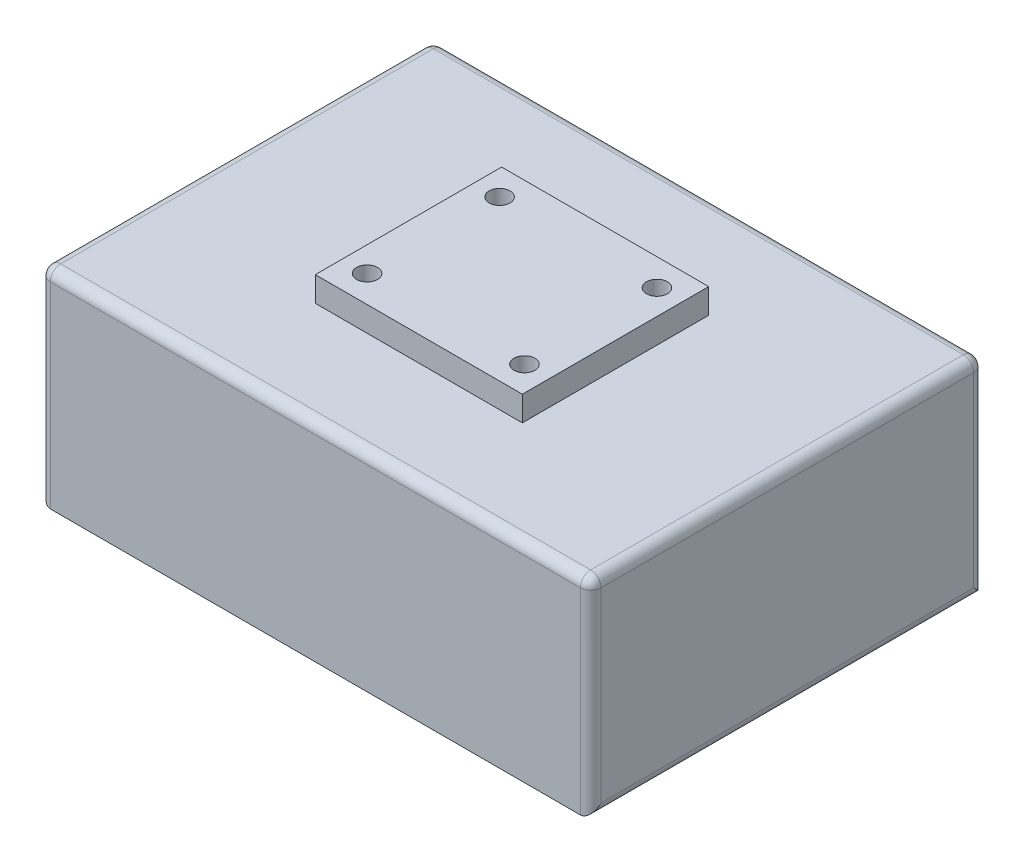
ISO-10303-21;
HEADER;
FILE_DESCRIPTION(('STEP AP214'),'2;1');
FILE_NAME('part.step','',(''),(''),'','','');
FILE_SCHEMA(('AUTOMOTIVE_DESIGN { 1 0 10303 214 1 1 1 1 }'));
ENDSEC;
DATA;
#1=APPLICATION_CONTEXT('core data for automotive mechanical design processes');
#2=APPLICATION_PROTOCOL_DEFINITION('international standard','automotive_design',2000,#1);
#3=PRODUCT_CONTEXT('',#1,'mechanical');
#4=PRODUCT('Part','Part','',(#3));
#5=PRODUCT_RELATED_PRODUCT_CATEGORY('part','',(#4));
#6=PRODUCT_DEFINITION_FORMATION('','',#4);
#7=PRODUCT_DEFINITION_CONTEXT('part definition',#1,'design');
#8=PRODUCT_DEFINITION('design','',#6,#7);
#9=PRODUCT_DEFINITION_SHAPE('','',#8);
#10=(LENGTH_UNIT() NAMED_UNIT(*) SI_UNIT(.MILLI.,.METRE.));
#11=(NAMED_UNIT(*) PLANE_ANGLE_UNIT() SI_UNIT($,.RADIAN.));
#12=(NAMED_UNIT(*) SI_UNIT($,.STERADIAN.) SOLID_ANGLE_UNIT());
#13=UNCERTAINTY_MEASURE_WITH_UNIT(LENGTH_MEASURE(1.E-05),#10,'distance_accuracy_value','');
#14=(GEOMETRIC_REPRESENTATION_CONTEXT(3) GLOBAL_UNCERTAINTY_ASSIGNED_CONTEXT((#13)) GLOBAL_UNIT_ASSIGNED_CONTEXT((#10,
#11,#12)) REPRESENTATION_CONTEXT('',''));
#15=CARTESIAN_POINT('',(0.,0.,0.));
#16=DIRECTION('',(0.,0.,1.));
#17=DIRECTION('',(1.,0.,0.));
#18=AXIS2_PLACEMENT_3D('',#15,#16,#17);
#19=CARTESIAN_POINT('',(0.,50.,0.));
#20=DIRECTION('',(0.,-1.,0.));
#21=DIRECTION('',(0.,0.,-1.));
#22=AXIS2_PLACEMENT_3D('',#19,#20,#21);
#23=PLANE('',#22);
#24=DIRECTION('',(0.,0.,-1.));
#25=VECTOR('',#24,1.);
#26=CARTESIAN_POINT('',(130.5,50.,0.));
#27=LINE('',#26,#25);
#28=CARTESIAN_POINT('',(130.5,50.,-2.5));
#29=VERTEX_POINT('',#28);
#30=CARTESIAN_POINT('',(130.5,50.,-92.5));
#31=VERTEX_POINT('',#30);
#32=EDGE_CURVE('E447',#29,#31,#27,.T.);
#33=ORIENTED_EDGE('',*,*,#32,.T.);
#34=DIRECTION('',(-1.,0.,0.));
#35=VECTOR('',#34,1.);
#36=CARTESIAN_POINT('',(0.,50.,-92.5));
#37=LINE('',#36,#35);
#38=CARTESIAN_POINT('',(2.5,50.,-92.5));
#39=VERTEX_POINT('',#38);
#40=EDGE_CURVE('E451',#31,#39,#37,.T.);
#41=ORIENTED_EDGE('',*,*,#40,.T.);
#42=DIRECTION('',(0.,0.,1.));
#43=VECTOR('',#42,1.);
#44=CARTESIAN_POINT('',(2.5,50.,0.));
#45=LINE('',#44,#43);
#46=CARTESIAN_POINT('',(2.5,50.,-2.5));
#47=VERTEX_POINT('',#46);
#48=EDGE_CURVE('E440',#39,#47,#45,.T.);
#49=ORIENTED_EDGE('',*,*,#48,.T.);
#50=DIRECTION('',(1.,0.,0.));
#51=VECTOR('',#50,1.);
#52=CARTESIAN_POINT('',(0.,50.,-2.5));
#53=LINE('',#52,#51);
#54=EDGE_CURVE('E444',#47,#29,#53,.T.);
#55=ORIENTED_EDGE('',*,*,#54,.T.);
#56=EDGE_LOOP('',(#33,#41,#49,#55));
#57=FACE_BOUND('',#56,.T.);
#58=DIRECTION('',(0.,0.,-1.));
#59=VECTOR('',#58,1.);
#60=CARTESIAN_POINT('',(91.5,50.,-70.));
#61=LINE('',#60,#59);
#62=CARTESIAN_POINT('',(91.5,50.,-25.));
#63=VERTEX_POINT('',#62);
#64=CARTESIAN_POINT('',(91.5,50.,-70.));
#65=VERTEX_POINT('',#64);
#66=EDGE_CURVE('E203',#63,#65,#61,.T.);
#67=ORIENTED_EDGE('',*,*,#66,.F.);
#68=DIRECTION('',(1.,0.,0.));
#69=VECTOR('',#68,1.);
#70=CARTESIAN_POINT('',(41.5,50.,-25.));
#71=LINE('',#70,#69);
#72=CARTESIAN_POINT('',(41.5,50.,-25.));
#73=VERTEX_POINT('',#72);
#74=EDGE_CURVE('E200',#73,#63,#71,.T.);
#75=ORIENTED_EDGE('',*,*,#74,.F.);
#76=DIRECTION('',(0.,0.,1.));
#77=VECTOR('',#76,1.);
#78=CARTESIAN_POINT('',(41.5,50.,-70.));
#79=LINE('',#78,#77);
#80=CARTESIAN_POINT('',(41.5,50.,-70.));
#81=VERTEX_POINT('',#80);
#82=EDGE_CURVE('E67',#81,#73,#79,.T.);
#83=ORIENTED_EDGE('',*,*,#82,.F.);
#84=DIRECTION('',(-1.,0.,0.));
#85=VECTOR('',#84,1.);
#86=CARTESIAN_POINT('',(41.5,50.,-70.));
#87=LINE('',#86,#85);
#88=EDGE_CURVE('E62',#65,#81,#87,.T.);
#89=ORIENTED_EDGE('',*,*,#88,.F.);
#90=EDGE_LOOP('',(#67,#75,#83,#89));
#91=FACE_BOUND('',#90,.T.);
#92=ADVANCED_FACE('F39',(#57,#91),#23,.F.);
#93=CARTESIAN_POINT('',(0.,0.,0.));
#94=DIRECTION('',(0.,-1.,0.));
#95=DIRECTION('',(0.,0.,-1.));
#96=AXIS2_PLACEMENT_3D('',#93,#94,#95);
#97=PLANE('',#96);
#98=DIRECTION('',(-1.,0.,0.));
#99=VECTOR('',#98,1.);
#100=CARTESIAN_POINT('',(0.,0.,-95.));
#101=LINE('',#100,#99);
#102=CARTESIAN_POINT('',(130.5,0.,-95.));
#103=VERTEX_POINT('',#102);
#104=CARTESIAN_POINT('',(2.5,0.,-95.));
#105=VERTEX_POINT('',#104);
#106=EDGE_CURVE('E227',#103,#105,#101,.T.);
#107=ORIENTED_EDGE('',*,*,#106,.F.);
#108=DIRECTION('',(0.,0.,-1.));
#109=VECTOR('',#108,1.);
#110=CARTESIAN_POINT('',(130.5,0.,0.));
#111=LINE('',#110,#109);
#112=CARTESIAN_POINT('',(130.5,0.,-94.));
#113=VERTEX_POINT('',#112);
#114=EDGE_CURVE('E260',#103,#113,#111,.F.);
#115=ORIENTED_EDGE('',*,*,#114,.T.);
#116=DIRECTION('',(-1.,0.,0.));
#117=VECTOR('',#116,1.);
#118=CARTESIAN_POINT('',(236.97716095374,0.,-94.));
#119=LINE('',#118,#117);
#120=CARTESIAN_POINT('',(2.5,0.,-94.));
#121=VERTEX_POINT('',#120);
#122=EDGE_CURVE('E220',#113,#121,#119,.T.);
#123=ORIENTED_EDGE('',*,*,#122,.T.);
#124=DIRECTION('',(0.,0.,1.));
#125=VECTOR('',#124,1.);
#126=CARTESIAN_POINT('',(2.5,0.,-95.));
#127=LINE('',#126,#125);
#128=EDGE_CURVE('E254',#121,#105,#127,.F.);
#129=ORIENTED_EDGE('',*,*,#128,.T.);
#130=EDGE_LOOP('',(#107,#115,#123,#129));
#131=FACE_BOUND('',#130,.T.);
#132=ADVANCED_FACE('F466',(#131),#97,.T.);
#133=CARTESIAN_POINT('',(0.,50.,0.));
#134=DIRECTION('',(1.,0.,0.));
#135=DIRECTION('',(0.,0.,-1.));
#136=AXIS2_PLACEMENT_3D('',#133,#134,#135);
#137=PLANE('',#136);
#138=DIRECTION('',(0.,0.,1.));
#139=VECTOR('',#138,1.);
#140=CARTESIAN_POINT('',(0.,47.5,0.));
#141=LINE('',#140,#139);
#142=CARTESIAN_POINT('',(0.,47.5,-2.5));
#143=VERTEX_POINT('',#142);
#144=CARTESIAN_POINT('',(0.,47.5,-92.5));
#145=VERTEX_POINT('',#144);
#146=EDGE_CURVE('E390',#143,#145,#141,.F.);
#147=ORIENTED_EDGE('',*,*,#146,.T.);
#148=DIRECTION('',(0.,-1.,0.));
#149=VECTOR('',#148,1.);
#150=CARTESIAN_POINT('',(0.,50.,-92.5));
#151=LINE('',#150,#149);
#152=CARTESIAN_POINT('',(0.,2.5,-92.5));
#153=VERTEX_POINT('',#152);
#154=EDGE_CURVE('E388',#145,#153,#151,.T.);
#155=ORIENTED_EDGE('',*,*,#154,.T.);
#156=DIRECTION('',(0.,0.,1.));
#157=VECTOR('',#156,1.);
#158=CARTESIAN_POINT('',(0.,2.5,-90.));
#159=LINE('',#158,#157);
#160=CARTESIAN_POINT('',(0.,2.5,-92.3799134149852));
#161=VERTEX_POINT('',#160);
#162=EDGE_CURVE('E383',#153,#161,#159,.T.);
#163=ORIENTED_EDGE('',*,*,#162,.T.);
#164=CARTESIAN_POINT('',(0.,0.,-47.5));
#165=DIRECTION('',(1.,0.,0.));
#166=DIRECTION('',(0.,0.,-1.));
#167=AXIS2_PLACEMENT_3D('',#164,#165,#166);
#168=CIRCLE('',#167,44.9494897427832);
#169=CARTESIAN_POINT('',(0.,2.5,-2.62008658501478));
#170=VERTEX_POINT('',#169);
#171=EDGE_CURVE('E379',#161,#170,#168,.T.);
#172=ORIENTED_EDGE('',*,*,#171,.T.);
#173=DIRECTION('',(0.,0.,1.));
#174=VECTOR('',#173,1.);
#175=CARTESIAN_POINT('',(0.,2.5,0.));
#176=LINE('',#175,#174);
#177=CARTESIAN_POINT('',(0.,2.5,-2.5));
#178=VERTEX_POINT('',#177);
#179=EDGE_CURVE('E455',#170,#178,#176,.T.);
#180=ORIENTED_EDGE('',*,*,#179,.T.);
#181=DIRECTION('',(0.,-1.,0.));
#182=VECTOR('',#181,1.);
#183=CARTESIAN_POINT('',(0.,50.,-2.5));
#184=LINE('',#183,#182);
#185=EDGE_CURVE('E457',#178,#143,#184,.F.);
#186=ORIENTED_EDGE('',*,*,#185,.T.);
#187=EDGE_LOOP('',(#147,#155,#163,#172,#180,#186));
#188=FACE_BOUND('',#187,.T.);
#189=ADVANCED_FACE('F459',(#188),#137,.F.);
#190=CARTESIAN_POINT('',(0.,50.,0.));
#191=DIRECTION('',(0.,0.,-1.));
#192=DIRECTION('',(-1.,0.,0.));
#193=AXIS2_PLACEMENT_3D('',#190,#191,#192);
#194=PLANE('',#193);
#195=DIRECTION('',(1.,0.,0.));
#196=VECTOR('',#195,1.);
#197=CARTESIAN_POINT('',(0.,0.,0.));
#198=LINE('',#197,#196);
#199=CARTESIAN_POINT('',(2.5,0.,0.));
#200=VERTEX_POINT('',#199);
#201=CARTESIAN_POINT('',(130.5,0.,0.));
#202=VERTEX_POINT('',#201);
#203=EDGE_CURVE('E215',#200,#202,#198,.T.);
#204=ORIENTED_EDGE('',*,*,#203,.T.);
#205=DIRECTION('',(0.,-1.,0.));
#206=VECTOR('',#205,1.);
#207=CARTESIAN_POINT('',(130.5,50.,0.));
#208=LINE('',#207,#206);
#209=CARTESIAN_POINT('',(130.5,47.5,0.));
#210=VERTEX_POINT('',#209);
#211=EDGE_CURVE('E245',#202,#210,#208,.F.);
#212=ORIENTED_EDGE('',*,*,#211,.T.);
#213=DIRECTION('',(1.,0.,0.));
#214=VECTOR('',#213,1.);
#215=CARTESIAN_POINT('',(0.,47.5,0.));
#216=LINE('',#215,#214);
#217=CARTESIAN_POINT('',(2.5,47.5,0.));
#218=VERTEX_POINT('',#217);
#219=EDGE_CURVE('E243',#210,#218,#216,.F.);
#220=ORIENTED_EDGE('',*,*,#219,.T.);
#221=DIRECTION('',(0.,-1.,0.));
#222=VECTOR('',#221,1.);
#223=CARTESIAN_POINT('',(2.5,50.,0.));
#224=LINE('',#223,#222);
#225=EDGE_CURVE('E241',#218,#200,#224,.T.);
#226=ORIENTED_EDGE('',*,*,#225,.T.);
#227=EDGE_LOOP('',(#204,#212,#220,#226));
#228=FACE_BOUND('',#227,.T.);
#229=ADVANCED_FACE('F581',(#228),#194,.F.);
#230=CARTESIAN_POINT('',(133.,50.,0.));
#231=DIRECTION('',(-1.,0.,0.));
#232=DIRECTION('',(0.,0.,1.));
#233=AXIS2_PLACEMENT_3D('',#230,#231,#232);
#234=PLANE('',#233);
#235=DIRECTION('',(0.,-1.,0.));
#236=VECTOR('',#235,1.);
#237=CARTESIAN_POINT('',(133.,50.,-2.5));
#238=LINE('',#237,#236);
#239=CARTESIAN_POINT('',(133.,47.5,-2.5));
#240=VERTEX_POINT('',#239);
#241=CARTESIAN_POINT('',(133.,2.5,-2.5));
#242=VERTEX_POINT('',#241);
#243=EDGE_CURVE('E236',#240,#242,#238,.T.);
#244=ORIENTED_EDGE('',*,*,#243,.T.);
#245=DIRECTION('',(0.,0.,-1.));
#246=VECTOR('',#245,1.);
#247=CARTESIAN_POINT('',(133.,2.5,-95.));
#248=LINE('',#247,#246);
#249=CARTESIAN_POINT('',(133.,2.5,-92.5));
#250=VERTEX_POINT('',#249);
#251=EDGE_CURVE('E239',#242,#250,#248,.T.);
#252=ORIENTED_EDGE('',*,*,#251,.T.);
#253=DIRECTION('',(0.,-1.,0.));
#254=VECTOR('',#253,1.);
#255=CARTESIAN_POINT('',(133.,50.,-92.5));
#256=LINE('',#255,#254);
#257=CARTESIAN_POINT('',(133.,47.5,-92.5));
#258=VERTEX_POINT('',#257);
#259=EDGE_CURVE('E234',#250,#258,#256,.F.);
#260=ORIENTED_EDGE('',*,*,#259,.T.);
#261=DIRECTION('',(0.,0.,-1.));
#262=VECTOR('',#261,1.);
#263=CARTESIAN_POINT('',(133.,47.5,0.));
#264=LINE('',#263,#262);
#265=EDGE_CURVE('E232',#258,#240,#264,.F.);
#266=ORIENTED_EDGE('',*,*,#265,.T.);
#267=EDGE_LOOP('',(#244,#252,#260,#266));
#268=FACE_BOUND('',#267,.T.);
#269=ADVANCED_FACE('F574',(#268),#234,.F.);
#270=CARTESIAN_POINT('',(0.,50.,-95.));
#271=DIRECTION('',(0.,0.,1.));
#272=DIRECTION('',(1.,0.,0.));
#273=AXIS2_PLACEMENT_3D('',#270,#271,#272);
#274=PLANE('',#273);
#275=DIRECTION('',(-1.,0.,0.));
#276=VECTOR('',#275,1.);
#277=CARTESIAN_POINT('',(0.,47.5,-95.));
#278=LINE('',#277,#276);
#279=CARTESIAN_POINT('',(2.5,47.5,-95.));
#280=VERTEX_POINT('',#279);
#281=CARTESIAN_POINT('',(130.5,47.5,-95.));
#282=VERTEX_POINT('',#281);
#283=EDGE_CURVE('E250',#280,#282,#278,.F.);
#284=ORIENTED_EDGE('',*,*,#283,.T.);
#285=DIRECTION('',(0.,-1.,0.));
#286=VECTOR('',#285,1.);
#287=CARTESIAN_POINT('',(130.5,50.,-95.));
#288=LINE('',#287,#286);
#289=EDGE_CURVE('E252',#282,#103,#288,.T.);
#290=ORIENTED_EDGE('',*,*,#289,.T.);
#291=ORIENTED_EDGE('',*,*,#106,.T.);
#292=DIRECTION('',(0.,-1.,0.));
#293=VECTOR('',#292,1.);
#294=CARTESIAN_POINT('',(2.5,50.,-95.));
#295=LINE('',#294,#293);
#296=EDGE_CURVE('E248',#105,#280,#295,.F.);
#297=ORIENTED_EDGE('',*,*,#296,.T.);
#298=EDGE_LOOP('',(#284,#290,#291,#297));
#299=FACE_BOUND('',#298,.T.);
#300=ADVANCED_FACE('F566',(#299),#274,.F.);
#301=DIRECTION('',(-1.,0.,0.));
#302=VECTOR('',#301,1.);
#303=CARTESIAN_POINT('',(236.97716095374,0.,-1.));
#304=LINE('',#303,#302);
#305=CARTESIAN_POINT('',(130.5,0.,-1.));
#306=VERTEX_POINT('',#305);
#307=CARTESIAN_POINT('',(2.5,0.,-1.));
#308=VERTEX_POINT('',#307);
#309=EDGE_CURVE('E216',#306,#308,#304,.T.);
#310=ORIENTED_EDGE('',*,*,#309,.F.);
#311=DIRECTION('',(0.,0.,-1.));
#312=VECTOR('',#311,1.);
#313=CARTESIAN_POINT('',(130.5,0.,0.));
#314=LINE('',#313,#312);
#315=EDGE_CURVE('E258',#306,#202,#314,.F.);
#316=ORIENTED_EDGE('',*,*,#315,.T.);
#317=ORIENTED_EDGE('',*,*,#203,.F.);
#318=DIRECTION('',(0.,0.,1.));
#319=VECTOR('',#318,1.);
#320=CARTESIAN_POINT('',(2.5,0.,-4.99999999999999));
#321=LINE('',#320,#319);
#322=EDGE_CURVE('E256',#200,#308,#321,.F.);
#323=ORIENTED_EDGE('',*,*,#322,.T.);
#324=EDGE_LOOP('',(#310,#316,#317,#323));
#325=FACE_BOUND('',#324,.T.);
#326=ADVANCED_FACE('F282',(#325),#97,.T.);
#327=CARTESIAN_POINT('',(236.97716095374,0.,-47.5));
#328=DIRECTION('',(-1.,0.,0.));
#329=DIRECTION('',(0.,0.,1.));
#330=AXIS2_PLACEMENT_3D('',#327,#328,#329);
#331=CYLINDRICAL_SURFACE('',#330,46.5);
#332=ORIENTED_EDGE('',*,*,#122,.F.);
#333=CARTESIAN_POINT('',(130.5,0.,-94.));
#334=CARTESIAN_POINT('',(130.584181603792,2.13688325373513E-05,-94.000003423339));
#335=CARTESIAN_POINT('',(130.667939072362,0.00424124135175873,-94.0000028489092));
#336=CARTESIAN_POINT('',(130.834605739028,0.0210779937604642,-93.9999937045119));
#337=CARTESIAN_POINT('',(130.917514937125,0.033694873646851,-93.9999851345445));
#338=CARTESIAN_POINT('',(131.,0.0505102572168243,-93.9999725668082));
#339=B_SPLINE_CURVE_WITH_KNOTS('',3,(#333,#334,#335,#336,#337,#338),.UNSPECIFIED.,.F.,.F.,(4,2,
4),(0.,0.251591112305826,0.503182224518847),.UNSPECIFIED.);
#340=CARTESIAN_POINT('',(131.,0.0505102572168239,-93.9999725668082));
#341=VERTEX_POINT('',#340);
#342=EDGE_CURVE('E296',#113,#341,#339,.T.);
#343=ORIENTED_EDGE('',*,*,#342,.T.);
#344=CARTESIAN_POINT('',(131.,0.,-47.5));
#345=DIRECTION('',(-1.,0.,0.));
#346=DIRECTION('',(0.,0.,1.));
#347=AXIS2_PLACEMENT_3D('',#344,#345,#346);
#348=CIRCLE('',#347,46.5);
#349=CARTESIAN_POINT('',(131.,0.0505102572168239,-1.0000274331918));
#350=VERTEX_POINT('',#349);
#351=EDGE_CURVE('E212',#341,#350,#348,.F.);
#352=ORIENTED_EDGE('',*,*,#351,.T.);
#353=CARTESIAN_POINT('',(131.,0.0505102572168239,-1.0000274331918));
#354=CARTESIAN_POINT('',(130.917514937125,0.0336948736468505,-1.00001486545554));
#355=CARTESIAN_POINT('',(130.834605739028,0.0210779937604639,-1.0000062954881));
#356=CARTESIAN_POINT('',(130.667939072362,0.00424124135175931,-0.999997151090829));
#357=CARTESIAN_POINT('',(130.584181603792,2.13688325386669E-05,-0.999996576661008));
#358=CARTESIAN_POINT('',(130.5,0.,-1.));
#359=B_SPLINE_CURVE_WITH_KNOTS('',3,(#353,#354,#355,#356,#357,#358),.UNSPECIFIED.,.F.,.F.,(4,2,
4),(0.,0.251591112213021,0.503182224518847),.UNSPECIFIED.);
#360=EDGE_CURVE('E290',#350,#306,#359,.T.);
#361=ORIENTED_EDGE('',*,*,#360,.T.);
#362=ORIENTED_EDGE('',*,*,#309,.T.);
#363=CARTESIAN_POINT('',(2.5,0.,-1.));
#364=CARTESIAN_POINT('',(2.41581839620813,2.13688325377501E-05,-0.999996576661009));
#365=CARTESIAN_POINT('',(2.33206092763793,0.00424124135175869,-0.999997151090831));
#366=CARTESIAN_POINT('',(2.16539426097158,0.0210779937604629,-1.0000062954881));
#367=CARTESIAN_POINT('',(2.08248506287511,0.0336948736468501,-1.00001486545554));
#368=CARTESIAN_POINT('',(2.,0.0505102572168243,-1.0000274331918));
#369=B_SPLINE_CURVE_WITH_KNOTS('',3,(#363,#364,#365,#366,#367,#368),.UNSPECIFIED.,.F.,.F.,(4,2,
4),(0.,0.251591112305807,0.503182224518847),.UNSPECIFIED.);
#370=CARTESIAN_POINT('',(2.,0.0505102572168239,-1.0000274331918));
#371=VERTEX_POINT('',#370);
#372=EDGE_CURVE('E269',#308,#371,#369,.T.);
#373=ORIENTED_EDGE('',*,*,#372,.T.);
#374=CARTESIAN_POINT('',(2.,0.,-47.5));
#375=DIRECTION('',(-1.,0.,0.));
#376=DIRECTION('',(0.,0.,1.));
#377=AXIS2_PLACEMENT_3D('',#374,#375,#376);
#378=CIRCLE('',#377,46.5);
#379=CARTESIAN_POINT('',(2.,0.0505102572168239,-93.9999725668082));
#380=VERTEX_POINT('',#379);
#381=EDGE_CURVE('E217',#371,#380,#378,.T.);
#382=ORIENTED_EDGE('',*,*,#381,.T.);
#383=CARTESIAN_POINT('',(2.,0.0505102572168239,-93.9999725668082));
#384=CARTESIAN_POINT('',(2.08248506287511,0.0336948736468496,-93.9999851345445));
#385=CARTESIAN_POINT('',(2.16539426097158,0.0210779937604626,-93.9999937045119));
#386=CARTESIAN_POINT('',(2.33206092763793,0.0042412413517591,-94.0000028489092));
#387=CARTESIAN_POINT('',(2.41581839620813,2.13688325388543E-05,-94.000003423339));
#388=CARTESIAN_POINT('',(2.5,0.,-94.));
#389=B_SPLINE_CURVE_WITH_KNOTS('',3,(#383,#384,#385,#386,#387,#388),.UNSPECIFIED.,.F.,.F.,(4,2,
4),(0.,0.251591112213039,0.503182224518847),.UNSPECIFIED.);
#390=EDGE_CURVE('E262',#380,#121,#389,.T.);
#391=ORIENTED_EDGE('',*,*,#390,.T.);
#392=EDGE_LOOP('',(#332,#343,#352,#361,#362,#373,#382,#391));
#393=FACE_BOUND('',#392,.T.);
#394=ADVANCED_FACE('F276',(#393),#331,.F.);
#395=CARTESIAN_POINT('',(2.,0.,-47.5));
#396=DIRECTION('',(-1.,0.,0.));
#397=DIRECTION('',(0.,0.,1.));
#398=AXIS2_PLACEMENT_3D('',#395,#396,#397);
#399=PLANE('',#398);
#400=ORIENTED_EDGE('',*,*,#381,.F.);
#401=DIRECTION('',(0.,0.,-1.));
#402=VECTOR('',#401,1.);
#403=CARTESIAN_POINT('',(2.,0.0505102572168239,-1.0000274331918));
#404=LINE('',#403,#402);
#405=CARTESIAN_POINT('',(2.,0.050510257216824,-5.00003001514099));
#406=VERTEX_POINT('',#405);
#407=EDGE_CURVE('E12',#371,#406,#404,.T.);
#408=ORIENTED_EDGE('',*,*,#407,.T.);
#409=CARTESIAN_POINT('',(2.,0.,-47.5));
#410=DIRECTION('',(-1.,0.,0.));
#411=DIRECTION('',(0.,0.,1.));
#412=AXIS2_PLACEMENT_3D('',#409,#410,#411);
#413=CIRCLE('',#412,42.5);
#414=CARTESIAN_POINT('',(2.,0.0505102572168242,-89.999969984859));
#415=VERTEX_POINT('',#414);
#416=EDGE_CURVE('E230',#406,#415,#413,.T.);
#417=ORIENTED_EDGE('',*,*,#416,.T.);
#418=DIRECTION('',(0.,0.,-1.));
#419=VECTOR('',#418,1.);
#420=CARTESIAN_POINT('',(2.,0.0505102572168242,-89.999969984859));
#421=LINE('',#420,#419);
#422=EDGE_CURVE('E54',#415,#380,#421,.T.);
#423=ORIENTED_EDGE('',*,*,#422,.T.);
#424=EDGE_LOOP('',(#400,#408,#417,#423));
#425=FACE_BOUND('',#424,.T.);
#426=ADVANCED_FACE('F281',(#425),#399,.F.);
#427=CARTESIAN_POINT('',(131.,50.,0.));
#428=DIRECTION('',(-1.,0.,0.));
#429=DIRECTION('',(0.,0.,1.));
#430=AXIS2_PLACEMENT_3D('',#427,#428,#429);
#431=PLANE('',#430);
#432=ORIENTED_EDGE('',*,*,#351,.F.);
#433=DIRECTION('',(0.,0.,1.));
#434=VECTOR('',#433,1.);
#435=CARTESIAN_POINT('',(131.,0.0505102572168239,-93.9999725668082));
#436=LINE('',#435,#434);
#437=EDGE_CURVE('E445',#341,#350,#436,.T.);
#438=ORIENTED_EDGE('',*,*,#437,.T.);
#439=EDGE_LOOP('',(#432,#438));
#440=FACE_BOUND('',#439,.T.);
#441=ADVANCED_FACE('F542',(#440),#431,.T.);
#442=CARTESIAN_POINT('',(2.5,2.5,0.));
#443=DIRECTION('',(0.,0.,-1.));
#444=DIRECTION('',(-1.,0.,0.));
#445=AXIS2_PLACEMENT_3D('',#442,#443,#444);
#446=CYLINDRICAL_SURFACE('',#445,2.5);
#447=ORIENTED_EDGE('',*,*,#390,.F.);
#448=ORIENTED_EDGE('',*,*,#422,.F.);
#449=CARTESIAN_POINT('',(2.,0.0505102572168242,-89.999969984859));
#450=CARTESIAN_POINT('',(1.93739125426876,0.063277521848252,-90.0127217609618));
#451=CARTESIAN_POINT('',(1.87577360760766,0.0783671962346952,-90.0277881196874));
#452=CARTESIAN_POINT('',(1.75503098622294,0.112755179350425,-90.0620990994424));
#453=CARTESIAN_POINT('',(1.6959021395973,0.132046638877352,-90.0813369204733));
#454=CARTESIAN_POINT('',(1.58102686568073,0.174231317447271,-90.1233700487397));
#455=CARTESIAN_POINT('',(1.52525225205664,0.197086089230291,-90.1461273625013));
#456=CARTESIAN_POINT('',(1.41667095469396,0.246125577396846,-90.1949129058237));
#457=CARTESIAN_POINT('',(1.3638654692533,0.272311624522098,-90.220942442487));
#458=CARTESIAN_POINT('',(1.21084851586098,0.354900659830152,-90.3029536118089));
#459=CARTESIAN_POINT('',(1.11519699473914,0.415652810146655,-90.3631754012105));
#460=CARTESIAN_POINT('',(0.936409953736706,0.54615716058448,-90.4922268039608));
#461=CARTESIAN_POINT('',(0.853314254698965,0.61593674414051,-90.561082586914));
#462=CARTESIAN_POINT('',(0.654770967198994,0.804908380203639,-90.7470572449916));
#463=CARTESIAN_POINT('',(0.548629304895066,0.929228291300059,-90.8689479684465));
#464=CARTESIAN_POINT('',(0.365408069993122,1.18894768960779,-91.1224233075319));
#465=CARTESIAN_POINT('',(0.288393083925409,1.32437099875773,-91.2540287020115));
#466=CARTESIAN_POINT('',(0.149864375016152,1.62835528716115,-91.5480455093412));
#467=CARTESIAN_POINT('',(0.0939810589274392,1.79836208423312,-91.7115994478339));
#468=CARTESIAN_POINT('',(0.019355255745988,2.14309247914608,-92.0413591404464));
#469=CARTESIAN_POINT('',(0.000518845557465326,2.31780300768397,-92.2075571088789));
#470=CARTESIAN_POINT('',(3.53018153403255E-06,2.49515301888906,-92.3753287428903));
#471=CARTESIAN_POINT('',(6.33693359578801E-09,2.497576491833,-92.3776211509131));
#472=CARTESIAN_POINT('',(0.,2.5,-92.3799134149852));
#473=B_SPLINE_CURVE_WITH_KNOTS('',3,(#449,#450,#451,#452,#453,#454,#455,#456,#457,#458,#459,
#460,#461,#462,#463,#464,#465,#466,#467,#468,#469,#470,#471,#472),.UNSPECIFIED.,.F.,.F.,(4,2,2,
2,2,2,2,2,2,2,2,4),(0.,0.19531789050569,0.390319750775296,0.583347130814134,0.776451862898057,
1.15983852424362,1.54441666797508,2.1527488863318,2.7624222415427,3.48663396900635,
4.2090072611757,4.21901501515334),.UNSPECIFIED.);
#474=EDGE_CURVE('E44',#161,#415,#473,.F.);
#475=ORIENTED_EDGE('',*,*,#474,.F.);
#476=ORIENTED_EDGE('',*,*,#162,.F.);
#477=CARTESIAN_POINT('',(2.5,2.5,-92.5));
#478=DIRECTION('',(0.,0.707106781186547,-0.707106781186547));
#479=DIRECTION('',(0.,-0.707106781186547,-0.707106781186547));
#480=AXIS2_PLACEMENT_3D('',#477,#478,#479);
#481=ELLIPSE('',#480,3.53553390593274,2.5);
#482=EDGE_CURVE('E366',#105,#153,#481,.T.);
#483=ORIENTED_EDGE('',*,*,#482,.F.);
#484=ORIENTED_EDGE('',*,*,#128,.F.);
#485=EDGE_LOOP('',(#447,#448,#475,#476,#483,#484));
#486=FACE_BOUND('',#485,.T.);
#487=ADVANCED_FACE('F41',(#486),#446,.T.);
#488=CARTESIAN_POINT('',(2.5,0.,-47.5));
#489=DIRECTION('',(1.,0.,0.));
#490=DIRECTION('',(0.,0.,-1.));
#491=AXIS2_PLACEMENT_3D('',#488,#489,#490);
#492=TOROIDAL_SURFACE('',#491,44.9494897427832,2.5);
#493=ORIENTED_EDGE('',*,*,#474,.T.);
#494=ORIENTED_EDGE('',*,*,#416,.F.);
#495=CARTESIAN_POINT('',(2.,0.050510257216824,-5.00003001514099));
#496=CARTESIAN_POINT('',(1.93739125426877,0.0632775218482504,-4.98727823903817));
#497=CARTESIAN_POINT('',(1.87577360760767,0.0783671962346938,-4.97221188031255));
#498=CARTESIAN_POINT('',(1.75503098622294,0.112755179350424,-4.9379009005576));
#499=CARTESIAN_POINT('',(1.6959021395973,0.132046638877352,-4.91866307952672));
#500=CARTESIAN_POINT('',(1.58102686568073,0.174231317447272,-4.87662995126034));
#501=CARTESIAN_POINT('',(1.52525225205664,0.197086089230292,-4.85387263749865));
#502=CARTESIAN_POINT('',(1.41667095469396,0.246125577396846,-4.80508709417631));
#503=CARTESIAN_POINT('',(1.3638654692533,0.272311624522098,-4.77905755751297));
#504=CARTESIAN_POINT('',(1.21084851586098,0.35490065983015,-4.69704638819108));
#505=CARTESIAN_POINT('',(1.11519699473915,0.415652810146649,-4.63682459878947));
#506=CARTESIAN_POINT('',(0.936409953736717,0.546157160584471,-4.50777319603915));
#507=CARTESIAN_POINT('',(0.853314254698973,0.615936744140503,-4.43891741308602));
#508=CARTESIAN_POINT('',(0.654770967198998,0.804908380203634,-4.25294275500844));
#509=CARTESIAN_POINT('',(0.54862930489507,0.929228291300052,-4.13105203155349));
#510=CARTESIAN_POINT('',(0.365408069993127,1.18894768960778,-3.87757669246806));
#511=CARTESIAN_POINT('',(0.288393083925414,1.32437099875772,-3.74597129798855));
#512=CARTESIAN_POINT('',(0.149864375016155,1.62835528716114,-3.4519544906588));
#513=CARTESIAN_POINT('',(0.0939810589274414,1.79836208423311,-3.28840055216608));
#514=CARTESIAN_POINT('',(0.0193552557459911,2.14309247914606,-2.95864085955363));
#515=CARTESIAN_POINT('',(0.000518845557469947,2.31780300768394,-2.7924428911211));
#516=CARTESIAN_POINT('',(3.53018153415955E-06,2.49515301888906,-2.62467125710971));
#517=CARTESIAN_POINT('',(6.33693366021947E-09,2.497576491833,-2.62237884908694));
#518=CARTESIAN_POINT('',(0.,2.5,-2.62008658501478));
#519=B_SPLINE_CURVE_WITH_KNOTS('',3,(#495,#496,#497,#498,#499,#500,#501,#502,#503,#504,#505,
#506,#507,#508,#509,#510,#511,#512,#513,#514,#515,#516,#517,#518),.UNSPECIFIED.,.F.,.F.,(4,2,2,
2,2,2,2,2,2,2,2,4),(0.,0.195317890505689,0.390319750775294,0.583347130814143,0.776451862898055,
1.15983852424361,1.54441666797508,2.15274888633179,2.76242224154269,3.48663396900634,
4.20900726117569,4.21901501515333),.UNSPECIFIED.);
#520=EDGE_CURVE('E359',#170,#406,#519,.F.);
#521=ORIENTED_EDGE('',*,*,#520,.F.);
#522=ORIENTED_EDGE('',*,*,#171,.F.);
#523=EDGE_LOOP('',(#493,#494,#521,#522));
#524=FACE_BOUND('',#523,.T.);
#525=ADVANCED_FACE('F351',(#524),#492,.T.);
#526=CARTESIAN_POINT('',(2.5,50.,-92.5));
#527=DIRECTION('',(0.,-1.,0.));
#528=DIRECTION('',(0.,0.,-1.));
#529=AXIS2_PLACEMENT_3D('',#526,#527,#528);
#530=CYLINDRICAL_SURFACE('',#529,2.5);
#531=ORIENTED_EDGE('',*,*,#482,.T.);
#532=ORIENTED_EDGE('',*,*,#154,.F.);
#533=CARTESIAN_POINT('',(2.5,47.5,-92.5));
#534=DIRECTION('',(0.,1.,0.));
#535=DIRECTION('',(0.,0.,1.));
#536=AXIS2_PLACEMENT_3D('',#533,#534,#535);
#537=CIRCLE('',#536,2.5);
#538=EDGE_CURVE('E367',#280,#145,#537,.T.);
#539=ORIENTED_EDGE('',*,*,#538,.F.);
#540=ORIENTED_EDGE('',*,*,#296,.F.);
#541=EDGE_LOOP('',(#531,#532,#539,#540));
#542=FACE_BOUND('',#541,.T.);
#543=ADVANCED_FACE('F354',(#542),#530,.T.);
#544=CARTESIAN_POINT('',(2.5,2.5,0.));
#545=DIRECTION('',(0.,0.,-1.));
#546=DIRECTION('',(-1.,0.,0.));
#547=AXIS2_PLACEMENT_3D('',#544,#545,#546);
#548=CYLINDRICAL_SURFACE('',#547,2.5);
#549=ORIENTED_EDGE('',*,*,#372,.F.);
#550=ORIENTED_EDGE('',*,*,#322,.F.);
#551=CARTESIAN_POINT('',(2.5,2.5,-2.5));
#552=DIRECTION('',(0.,-0.707106781186547,-0.707106781186547));
#553=DIRECTION('',(0.,0.707106781186547,-0.707106781186547));
#554=AXIS2_PLACEMENT_3D('',#551,#552,#553);
#555=ELLIPSE('',#554,3.53553390593274,2.5);
#556=EDGE_CURVE('E427',#178,#200,#555,.F.);
#557=ORIENTED_EDGE('',*,*,#556,.F.);
#558=ORIENTED_EDGE('',*,*,#179,.F.);
#559=ORIENTED_EDGE('',*,*,#520,.T.);
#560=ORIENTED_EDGE('',*,*,#407,.F.);
#561=EDGE_LOOP('',(#549,#550,#557,#558,#559,#560));
#562=FACE_BOUND('',#561,.T.);
#563=ADVANCED_FACE('F349',(#562),#548,.T.);
#564=CARTESIAN_POINT('',(2.5,47.5,-92.5));
#565=DIRECTION('',(-1.,0.,0.));
#566=DIRECTION('',(0.,0.,1.));
#567=AXIS2_PLACEMENT_3D('',#564,#565,#566);
#568=SPHERICAL_SURFACE('',#567,2.5);
#569=CARTESIAN_POINT('',(2.5,47.5,-92.5));
#570=DIRECTION('',(-1.,0.,0.));
#571=DIRECTION('',(0.,0.,1.));
#572=AXIS2_PLACEMENT_3D('',#569,#570,#571);
#573=CIRCLE('',#572,2.5);
#574=EDGE_CURVE('E422',#280,#39,#573,.F.);
#575=ORIENTED_EDGE('',*,*,#574,.F.);
#576=ORIENTED_EDGE('',*,*,#538,.T.);
#577=CARTESIAN_POINT('',(2.5,47.5,-92.5));
#578=DIRECTION('',(0.,0.,-1.));
#579=DIRECTION('',(-1.,0.,0.));
#580=AXIS2_PLACEMENT_3D('',#577,#578,#579);
#581=CIRCLE('',#580,2.5);
#582=EDGE_CURVE('E425',#39,#145,#581,.F.);
#583=ORIENTED_EDGE('',*,*,#582,.F.);
#584=EDGE_LOOP('',(#575,#576,#583));
#585=FACE_BOUND('',#584,.T.);
#586=ADVANCED_FACE('F346',(#585),#568,.T.);
#587=CARTESIAN_POINT('',(2.5,50.,-2.5));
#588=DIRECTION('',(0.,-1.,0.));
#589=DIRECTION('',(0.,0.,-1.));
#590=AXIS2_PLACEMENT_3D('',#587,#588,#589);
#591=CYLINDRICAL_SURFACE('',#590,2.5);
#592=ORIENTED_EDGE('',*,*,#556,.T.);
#593=ORIENTED_EDGE('',*,*,#225,.F.);
#594=CARTESIAN_POINT('',(2.5,47.5,-2.5));
#595=DIRECTION('',(0.,1.,0.));
#596=DIRECTION('',(0.,0.,1.));
#597=AXIS2_PLACEMENT_3D('',#594,#595,#596);
#598=CIRCLE('',#597,2.5);
#599=EDGE_CURVE('E419',#143,#218,#598,.T.);
#600=ORIENTED_EDGE('',*,*,#599,.F.);
#601=ORIENTED_EDGE('',*,*,#185,.F.);
#602=EDGE_LOOP('',(#592,#593,#600,#601));
#603=FACE_BOUND('',#602,.T.);
#604=ADVANCED_FACE('F342',(#603),#591,.T.);
#605=CARTESIAN_POINT('',(2.5,47.5,0.));
#606=DIRECTION('',(0.,0.,1.));
#607=DIRECTION('',(1.,0.,0.));
#608=AXIS2_PLACEMENT_3D('',#605,#606,#607);
#609=CYLINDRICAL_SURFACE('',#608,2.5);
#610=ORIENTED_EDGE('',*,*,#582,.T.);
#611=ORIENTED_EDGE('',*,*,#146,.F.);
#612=CARTESIAN_POINT('',(2.5,47.5,-2.5));
#613=DIRECTION('',(0.,0.,1.));
#614=DIRECTION('',(1.,0.,0.));
#615=AXIS2_PLACEMENT_3D('',#612,#613,#614);
#616=CIRCLE('',#615,2.5);
#617=EDGE_CURVE('E416',#47,#143,#616,.T.);
#618=ORIENTED_EDGE('',*,*,#617,.F.);
#619=ORIENTED_EDGE('',*,*,#48,.F.);
#620=EDGE_LOOP('',(#610,#611,#618,#619));
#621=FACE_BOUND('',#620,.T.);
#622=ADVANCED_FACE('F338',(#621),#609,.T.);
#623=CARTESIAN_POINT('',(0.,47.5,-92.5));
#624=DIRECTION('',(-1.,0.,0.));
#625=DIRECTION('',(0.,0.,1.));
#626=AXIS2_PLACEMENT_3D('',#623,#624,#625);
#627=CYLINDRICAL_SURFACE('',#626,2.5);
#628=ORIENTED_EDGE('',*,*,#574,.T.);
#629=ORIENTED_EDGE('',*,*,#40,.F.);
#630=CARTESIAN_POINT('',(130.5,47.5,-92.5));
#631=DIRECTION('',(1.,0.,0.));
#632=DIRECTION('',(0.,0.,-1.));
#633=AXIS2_PLACEMENT_3D('',#630,#631,#632);
#634=CIRCLE('',#633,2.5);
#635=EDGE_CURVE('E413',#282,#31,#634,.T.);
#636=ORIENTED_EDGE('',*,*,#635,.F.);
#637=ORIENTED_EDGE('',*,*,#283,.F.);
#638=EDGE_LOOP('',(#628,#629,#636,#637));
#639=FACE_BOUND('',#638,.T.);
#640=ADVANCED_FACE('F334',(#639),#627,.T.);
#641=CARTESIAN_POINT('',(2.5,47.5,-2.5));
#642=DIRECTION('',(-1.,0.,0.));
#643=DIRECTION('',(0.,0.,1.));
#644=AXIS2_PLACEMENT_3D('',#641,#642,#643);
#645=SPHERICAL_SURFACE('',#644,2.5);
#646=ORIENTED_EDGE('',*,*,#617,.T.);
#647=ORIENTED_EDGE('',*,*,#599,.T.);
#648=CARTESIAN_POINT('',(2.5,47.5,-2.5));
#649=DIRECTION('',(-1.,0.,0.));
#650=DIRECTION('',(0.,0.,1.));
#651=AXIS2_PLACEMENT_3D('',#648,#649,#650);
#652=CIRCLE('',#651,2.5);
#653=EDGE_CURVE('E410',#47,#218,#652,.F.);
#654=ORIENTED_EDGE('',*,*,#653,.F.);
#655=EDGE_LOOP('',(#646,#647,#654));
#656=FACE_BOUND('',#655,.T.);
#657=ADVANCED_FACE('F330',(#656),#645,.T.);
#658=CARTESIAN_POINT('',(130.5,47.5,-92.5));
#659=DIRECTION('',(0.,1.,0.));
#660=DIRECTION('',(0.,0.,1.));
#661=AXIS2_PLACEMENT_3D('',#658,#659,#660);
#662=SPHERICAL_SURFACE('',#661,2.5);
#663=CARTESIAN_POINT('',(130.5,47.5,-92.5));
#664=DIRECTION('',(0.,1.,0.));
#665=DIRECTION('',(0.,0.,1.));
#666=AXIS2_PLACEMENT_3D('',#663,#664,#665);
#667=CIRCLE('',#666,2.5);
#668=EDGE_CURVE('E404',#282,#258,#667,.F.);
#669=ORIENTED_EDGE('',*,*,#668,.F.);
#670=ORIENTED_EDGE('',*,*,#635,.T.);
#671=CARTESIAN_POINT('',(130.5,47.5,-92.5));
#672=DIRECTION('',(0.,0.,-1.));
#673=DIRECTION('',(-1.,0.,0.));
#674=AXIS2_PLACEMENT_3D('',#671,#672,#673);
#675=CIRCLE('',#674,2.5);
#676=EDGE_CURVE('E407',#258,#31,#675,.F.);
#677=ORIENTED_EDGE('',*,*,#676,.F.);
#678=EDGE_LOOP('',(#669,#670,#677));
#679=FACE_BOUND('',#678,.T.);
#680=ADVANCED_FACE('F326',(#679),#662,.T.);
#681=CARTESIAN_POINT('',(0.,47.5,-2.5));
#682=DIRECTION('',(1.,0.,0.));
#683=DIRECTION('',(0.,0.,-1.));
#684=AXIS2_PLACEMENT_3D('',#681,#682,#683);
#685=CYLINDRICAL_SURFACE('',#684,2.5);
#686=ORIENTED_EDGE('',*,*,#653,.T.);
#687=ORIENTED_EDGE('',*,*,#219,.F.);
#688=CARTESIAN_POINT('',(130.5,47.5,-2.5));
#689=DIRECTION('',(1.,0.,0.));
#690=DIRECTION('',(0.,0.,-1.));
#691=AXIS2_PLACEMENT_3D('',#688,#689,#690);
#692=CIRCLE('',#691,2.5);
#693=EDGE_CURVE('E401',#29,#210,#692,.T.);
#694=ORIENTED_EDGE('',*,*,#693,.F.);
#695=ORIENTED_EDGE('',*,*,#54,.F.);
#696=EDGE_LOOP('',(#686,#687,#694,#695));
#697=FACE_BOUND('',#696,.T.);
#698=ADVANCED_FACE('F322',(#697),#685,.T.);
#699=CARTESIAN_POINT('',(130.5,47.5,0.));
#700=DIRECTION('',(0.,0.,-1.));
#701=DIRECTION('',(-1.,0.,0.));
#702=AXIS2_PLACEMENT_3D('',#699,#700,#701);
#703=CYLINDRICAL_SURFACE('',#702,2.5);
#704=ORIENTED_EDGE('',*,*,#676,.T.);
#705=ORIENTED_EDGE('',*,*,#32,.F.);
#706=CARTESIAN_POINT('',(130.5,47.5,-2.5));
#707=DIRECTION('',(0.,0.,1.));
#708=DIRECTION('',(1.,0.,0.));
#709=AXIS2_PLACEMENT_3D('',#706,#707,#708);
#710=CIRCLE('',#709,2.5);
#711=EDGE_CURVE('E398',#240,#29,#710,.T.);
#712=ORIENTED_EDGE('',*,*,#711,.F.);
#713=ORIENTED_EDGE('',*,*,#265,.F.);
#714=EDGE_LOOP('',(#704,#705,#712,#713));
#715=FACE_BOUND('',#714,.T.);
#716=ADVANCED_FACE('F318',(#715),#703,.T.);
#717=CARTESIAN_POINT('',(130.5,50.,-92.5));
#718=DIRECTION('',(0.,-1.,0.));
#719=DIRECTION('',(0.,0.,-1.));
#720=AXIS2_PLACEMENT_3D('',#717,#718,#719);
#721=CYLINDRICAL_SURFACE('',#720,2.5);
#722=ORIENTED_EDGE('',*,*,#668,.T.);
#723=ORIENTED_EDGE('',*,*,#259,.F.);
#724=CARTESIAN_POINT('',(130.5,2.5,-92.5));
#725=DIRECTION('',(0.,-0.707106781186547,0.707106781186547));
#726=DIRECTION('',(0.,0.707106781186547,0.707106781186547));
#727=AXIS2_PLACEMENT_3D('',#724,#725,#726);
#728=ELLIPSE('',#727,3.53553390593274,2.5);
#729=EDGE_CURVE('E395',#103,#250,#728,.T.);
#730=ORIENTED_EDGE('',*,*,#729,.F.);
#731=ORIENTED_EDGE('',*,*,#289,.F.);
#732=EDGE_LOOP('',(#722,#723,#730,#731));
#733=FACE_BOUND('',#732,.T.);
#734=ADVANCED_FACE('F314',(#733),#721,.T.);
#735=CARTESIAN_POINT('',(130.5,47.5,-2.5));
#736=DIRECTION('',(0.,1.,0.));
#737=DIRECTION('',(0.,0.,1.));
#738=AXIS2_PLACEMENT_3D('',#735,#736,#737);
#739=SPHERICAL_SURFACE('',#738,2.5);
#740=ORIENTED_EDGE('',*,*,#711,.T.);
#741=ORIENTED_EDGE('',*,*,#693,.T.);
#742=CARTESIAN_POINT('',(130.5,47.5,-2.5));
#743=DIRECTION('',(0.,1.,0.));
#744=DIRECTION('',(0.,0.,1.));
#745=AXIS2_PLACEMENT_3D('',#742,#743,#744);
#746=CIRCLE('',#745,2.5);
#747=EDGE_CURVE('E206',#240,#210,#746,.F.);
#748=ORIENTED_EDGE('',*,*,#747,.F.);
#749=EDGE_LOOP('',(#740,#741,#748));
#750=FACE_BOUND('',#749,.T.);
#751=ADVANCED_FACE('F308',(#750),#739,.T.);
#752=CARTESIAN_POINT('',(130.5,2.5,0.));
#753=DIRECTION('',(0.,0.,1.));
#754=DIRECTION('',(1.,0.,0.));
#755=AXIS2_PLACEMENT_3D('',#752,#753,#754);
#756=CYLINDRICAL_SURFACE('',#755,2.5);
#757=ORIENTED_EDGE('',*,*,#729,.T.);
#758=ORIENTED_EDGE('',*,*,#251,.F.);
#759=CARTESIAN_POINT('',(130.5,2.5,-2.5));
#760=DIRECTION('',(0.,0.707106781186547,0.707106781186547));
#761=DIRECTION('',(0.,-0.707106781186547,0.707106781186547));
#762=AXIS2_PLACEMENT_3D('',#759,#760,#761);
#763=ELLIPSE('',#762,3.53553390593274,2.5);
#764=EDGE_CURVE('E204',#202,#242,#763,.T.);
#765=ORIENTED_EDGE('',*,*,#764,.F.);
#766=ORIENTED_EDGE('',*,*,#315,.F.);
#767=ORIENTED_EDGE('',*,*,#360,.F.);
#768=ORIENTED_EDGE('',*,*,#437,.F.);
#769=ORIENTED_EDGE('',*,*,#342,.F.);
#770=ORIENTED_EDGE('',*,*,#114,.F.);
#771=EDGE_LOOP('',(#757,#758,#765,#766,#767,#768,#769,#770));
#772=FACE_BOUND('',#771,.T.);
#773=ADVANCED_FACE('F302',(#772),#756,.T.);
#774=CARTESIAN_POINT('',(130.5,50.,-2.5));
#775=DIRECTION('',(0.,-1.,0.));
#776=DIRECTION('',(0.,0.,-1.));
#777=AXIS2_PLACEMENT_3D('',#774,#775,#776);
#778=CYLINDRICAL_SURFACE('',#777,2.5);
#779=ORIENTED_EDGE('',*,*,#747,.T.);
#780=ORIENTED_EDGE('',*,*,#211,.F.);
#781=ORIENTED_EDGE('',*,*,#764,.T.);
#782=ORIENTED_EDGE('',*,*,#243,.F.);
#783=EDGE_LOOP('',(#779,#780,#781,#782));
#784=FACE_BOUND('',#783,.T.);
#785=ADVANCED_FACE('F307',(#784),#778,.T.);
#786=CARTESIAN_POINT('',(91.5,56.,-70.));
#787=DIRECTION('',(-1.,0.,0.));
#788=DIRECTION('',(0.,0.,1.));
#789=AXIS2_PLACEMENT_3D('',#786,#787,#788);
#790=PLANE('',#789);
#791=ORIENTED_EDGE('',*,*,#66,.T.);
#792=DIRECTION('',(0.,-1.,0.));
#793=VECTOR('',#792,1.);
#794=CARTESIAN_POINT('',(91.5,56.,-70.));
#795=LINE('',#794,#793);
#796=CARTESIAN_POINT('',(91.5,56.,-70.));
#797=VERTEX_POINT('',#796);
#798=EDGE_CURVE('E184',#797,#65,#795,.T.);
#799=ORIENTED_EDGE('',*,*,#798,.F.);
#800=DIRECTION('',(0.,0.,-1.));
#801=VECTOR('',#800,1.);
#802=CARTESIAN_POINT('',(91.5,56.,-70.));
#803=LINE('',#802,#801);
#804=CARTESIAN_POINT('',(91.5,56.,-25.));
#805=VERTEX_POINT('',#804);
#806=EDGE_CURVE('E191',#805,#797,#803,.T.);
#807=ORIENTED_EDGE('',*,*,#806,.F.);
#808=DIRECTION('',(0.,-1.,0.));
#809=VECTOR('',#808,1.);
#810=CARTESIAN_POINT('',(91.5,56.,-25.));
#811=LINE('',#810,#809);
#812=EDGE_CURVE('E479',#805,#63,#811,.T.);
#813=ORIENTED_EDGE('',*,*,#812,.T.);
#814=EDGE_LOOP('',(#791,#799,#807,#813));
#815=FACE_BOUND('',#814,.T.);
#816=ADVANCED_FACE('F202',(#815),#790,.F.);
#817=CARTESIAN_POINT('',(41.5,56.,-70.));
#818=DIRECTION('',(0.,0.,1.));
#819=DIRECTION('',(1.,0.,0.));
#820=AXIS2_PLACEMENT_3D('',#817,#818,#819);
#821=PLANE('',#820);
#822=ORIENTED_EDGE('',*,*,#88,.T.);
#823=DIRECTION('',(0.,-1.,0.));
#824=VECTOR('',#823,1.);
#825=CARTESIAN_POINT('',(41.5,56.,-70.));
#826=LINE('',#825,#824);
#827=CARTESIAN_POINT('',(41.5,56.,-70.));
#828=VERTEX_POINT('',#827);
#829=EDGE_CURVE('E187',#828,#81,#826,.T.);
#830=ORIENTED_EDGE('',*,*,#829,.F.);
#831=DIRECTION('',(-1.,0.,0.));
#832=VECTOR('',#831,1.);
#833=CARTESIAN_POINT('',(41.5,56.,-70.));
#834=LINE('',#833,#832);
#835=EDGE_CURVE('E180',#797,#828,#834,.T.);
#836=ORIENTED_EDGE('',*,*,#835,.F.);
#837=ORIENTED_EDGE('',*,*,#798,.T.);
#838=EDGE_LOOP('',(#822,#830,#836,#837));
#839=FACE_BOUND('',#838,.T.);
#840=ADVANCED_FACE('F182',(#839),#821,.F.);
#841=CARTESIAN_POINT('',(41.5,56.,-70.));
#842=DIRECTION('',(1.,0.,0.));
#843=DIRECTION('',(0.,0.,-1.));
#844=AXIS2_PLACEMENT_3D('',#841,#842,#843);
#845=PLANE('',#844);
#846=ORIENTED_EDGE('',*,*,#82,.T.);
#847=DIRECTION('',(0.,-1.,0.));
#848=VECTOR('',#847,1.);
#849=CARTESIAN_POINT('',(41.5,56.,-25.));
#850=LINE('',#849,#848);
#851=CARTESIAN_POINT('',(41.5,56.,-25.));
#852=VERTEX_POINT('',#851);
#853=EDGE_CURVE('E208',#852,#73,#850,.T.);
#854=ORIENTED_EDGE('',*,*,#853,.F.);
#855=DIRECTION('',(0.,0.,1.));
#856=VECTOR('',#855,1.);
#857=CARTESIAN_POINT('',(41.5,56.,-70.));
#858=LINE('',#857,#856);
#859=EDGE_CURVE('E190',#828,#852,#858,.T.);
#860=ORIENTED_EDGE('',*,*,#859,.F.);
#861=ORIENTED_EDGE('',*,*,#829,.T.);
#862=EDGE_LOOP('',(#846,#854,#860,#861));
#863=FACE_BOUND('',#862,.T.);
#864=ADVANCED_FACE('F535',(#863),#845,.F.);
#865=CARTESIAN_POINT('',(41.5,56.,-25.));
#866=DIRECTION('',(0.,0.,-1.));
#867=DIRECTION('',(-1.,0.,0.));
#868=AXIS2_PLACEMENT_3D('',#865,#866,#867);
#869=PLANE('',#868);
#870=ORIENTED_EDGE('',*,*,#74,.T.);
#871=ORIENTED_EDGE('',*,*,#812,.F.);
#872=DIRECTION('',(1.,0.,0.));
#873=VECTOR('',#872,1.);
#874=CARTESIAN_POINT('',(41.5,56.,-25.));
#875=LINE('',#874,#873);
#876=EDGE_CURVE('E196',#852,#805,#875,.T.);
#877=ORIENTED_EDGE('',*,*,#876,.F.);
#878=ORIENTED_EDGE('',*,*,#853,.T.);
#879=EDGE_LOOP('',(#870,#871,#877,#878));
#880=FACE_BOUND('',#879,.T.);
#881=ADVANCED_FACE('F478',(#880),#869,.F.);
#882=CARTESIAN_POINT('',(0.,56.,0.));
#883=DIRECTION('',(0.,1.,0.));
#884=DIRECTION('',(0.,0.,1.));
#885=AXIS2_PLACEMENT_3D('',#882,#883,#884);
#886=PLANE('',#885);
#887=CARTESIAN_POINT('',(47.5,56.,-31.5));
#888=DIRECTION('',(0.,1.,0.));
#889=DIRECTION('',(0.,0.,1.));
#890=AXIS2_PLACEMENT_3D('',#887,#888,#889);
#891=CIRCLE('',#890,2.525);
#892=CARTESIAN_POINT('',(47.5,56.,-28.975));
#893=VERTEX_POINT('',#892);
#894=EDGE_CURVE('E497',#893,#893,#891,.T.);
#895=ORIENTED_EDGE('',*,*,#894,.F.);
#896=EDGE_LOOP('',(#895));
#897=FACE_BOUND('',#896,.T.);
#898=CARTESIAN_POINT('',(85.5,56.,-31.5));
#899=DIRECTION('',(0.,1.,0.));
#900=DIRECTION('',(0.,0.,1.));
#901=AXIS2_PLACEMENT_3D('',#898,#899,#900);
#902=CIRCLE('',#901,2.52499999999999);
#903=CARTESIAN_POINT('',(85.5,56.,-28.975));
#904=VERTEX_POINT('',#903);
#905=EDGE_CURVE('E503',#904,#904,#902,.T.);
#906=ORIENTED_EDGE('',*,*,#905,.F.);
#907=EDGE_LOOP('',(#906));
#908=FACE_BOUND('',#907,.T.);
#909=CARTESIAN_POINT('',(85.5,56.,-63.5));
#910=DIRECTION('',(0.,1.,0.));
#911=DIRECTION('',(0.,0.,1.));
#912=AXIS2_PLACEMENT_3D('',#909,#910,#911);
#913=CIRCLE('',#912,2.52499999999999);
#914=CARTESIAN_POINT('',(85.5,56.,-60.975));
#915=VERTEX_POINT('',#914);
#916=EDGE_CURVE('E491',#915,#915,#913,.T.);
#917=ORIENTED_EDGE('',*,*,#916,.F.);
#918=EDGE_LOOP('',(#917));
#919=FACE_BOUND('',#918,.T.);
#920=CARTESIAN_POINT('',(47.5,56.,-63.5));
#921=DIRECTION('',(0.,1.,0.));
#922=DIRECTION('',(0.,0.,1.));
#923=AXIS2_PLACEMENT_3D('',#920,#921,#922);
#924=CIRCLE('',#923,2.525);
#925=CARTESIAN_POINT('',(47.5,56.,-60.975));
#926=VERTEX_POINT('',#925);
#927=EDGE_CURVE('E488',#926,#926,#924,.T.);
#928=ORIENTED_EDGE('',*,*,#927,.F.);
#929=EDGE_LOOP('',(#928));
#930=FACE_BOUND('',#929,.T.);
#931=ORIENTED_EDGE('',*,*,#806,.T.);
#932=ORIENTED_EDGE('',*,*,#835,.T.);
#933=ORIENTED_EDGE('',*,*,#859,.T.);
#934=ORIENTED_EDGE('',*,*,#876,.T.);
#935=EDGE_LOOP('',(#931,#932,#933,#934));
#936=FACE_BOUND('',#935,.T.);
#937=ADVANCED_FACE('F194',(#897,#908,#919,#930,#936),#886,.T.);
#938=CARTESIAN_POINT('',(47.5,52.,-63.5));
#939=DIRECTION('',(0.,1.,0.));
#940=DIRECTION('',(0.,0.,1.));
#941=AXIS2_PLACEMENT_3D('',#938,#939,#940);
#942=CYLINDRICAL_SURFACE('',#941,2.525);
#943=CARTESIAN_POINT('',(47.5,52.,-63.5));
#944=DIRECTION('',(0.,1.,0.));
#945=DIRECTION('',(0.,0.,1.));
#946=AXIS2_PLACEMENT_3D('',#943,#944,#945);
#947=CIRCLE('',#946,2.525);
#948=CARTESIAN_POINT('',(47.5,52.,-60.975));
#949=VERTEX_POINT('',#948);
#950=EDGE_CURVE('E474',#949,#949,#947,.T.);
#951=ORIENTED_EDGE('',*,*,#950,.F.);
#952=EDGE_LOOP('',(#951));
#953=FACE_BOUND('',#952,.T.);
#954=ORIENTED_EDGE('',*,*,#927,.T.);
#955=EDGE_LOOP('',(#954));
#956=FACE_BOUND('',#955,.T.);
#957=ADVANCED_FACE('F516',(#953,#956),#942,.F.);
#958=CARTESIAN_POINT('',(47.5,52.,-63.5));
#959=DIRECTION('',(0.,1.,0.));
#960=DIRECTION('',(0.,0.,1.));
#961=AXIS2_PLACEMENT_3D('',#958,#959,#960);
#962=PLANE('',#961);
#963=ORIENTED_EDGE('',*,*,#950,.T.);
#964=EDGE_LOOP('',(#963));
#965=FACE_BOUND('',#964,.T.);
#966=ADVANCED_FACE('F522',(#965),#962,.T.);
#967=CARTESIAN_POINT('',(85.5,52.,-63.5));
#968=DIRECTION('',(0.,1.,0.));
#969=DIRECTION('',(0.,0.,1.));
#970=AXIS2_PLACEMENT_3D('',#967,#968,#969);
#971=CYLINDRICAL_SURFACE('',#970,2.52499999999999);
#972=CARTESIAN_POINT('',(85.5,52.,-63.5));
#973=DIRECTION('',(0.,1.,0.));
#974=DIRECTION('',(0.,0.,1.));
#975=AXIS2_PLACEMENT_3D('',#972,#973,#974);
#976=CIRCLE('',#975,2.52499999999999);
#977=CARTESIAN_POINT('',(85.5,52.,-60.975));
#978=VERTEX_POINT('',#977);
#979=EDGE_CURVE('E506',#978,#978,#976,.T.);
#980=ORIENTED_EDGE('',*,*,#979,.F.);
#981=EDGE_LOOP('',(#980));
#982=FACE_BOUND('',#981,.T.);
#983=ORIENTED_EDGE('',*,*,#916,.T.);
#984=EDGE_LOOP('',(#983));
#985=FACE_BOUND('',#984,.T.);
#986=ADVANCED_FACE('F512',(#982,#985),#971,.F.);
#987=CARTESIAN_POINT('',(85.5,52.,-63.5));
#988=DIRECTION('',(0.,1.,0.));
#989=DIRECTION('',(0.,0.,1.));
#990=AXIS2_PLACEMENT_3D('',#987,#988,#989);
#991=PLANE('',#990);
#992=ORIENTED_EDGE('',*,*,#979,.T.);
#993=EDGE_LOOP('',(#992));
#994=FACE_BOUND('',#993,.T.);
#995=ADVANCED_FACE('F787',(#994),#991,.T.);
#996=CARTESIAN_POINT('',(85.5,52.,-31.5));
#997=DIRECTION('',(0.,1.,0.));
#998=DIRECTION('',(0.,0.,1.));
#999=AXIS2_PLACEMENT_3D('',#996,#997,#998);
#1000=CYLINDRICAL_SURFACE('',#999,2.52499999999999);
#1001=CARTESIAN_POINT('',(85.5,52.,-31.5));
#1002=DIRECTION('',(0.,1.,0.));
#1003=DIRECTION('',(0.,0.,1.));
#1004=AXIS2_PLACEMENT_3D('',#1001,#1002,#1003);
#1005=CIRCLE('',#1004,2.52499999999999);
#1006=CARTESIAN_POINT('',(85.5,52.,-28.975));
#1007=VERTEX_POINT('',#1006);
#1008=EDGE_CURVE('E500',#1007,#1007,#1005,.T.);
#1009=ORIENTED_EDGE('',*,*,#1008,.F.);
#1010=EDGE_LOOP('',(#1009));
#1011=FACE_BOUND('',#1010,.T.);
#1012=ORIENTED_EDGE('',*,*,#905,.T.);
#1013=EDGE_LOOP('',(#1012));
#1014=FACE_BOUND('',#1013,.T.);
#1015=ADVANCED_FACE('F798',(#1011,#1014),#1000,.F.);
#1016=CARTESIAN_POINT('',(85.5,52.,-31.5));
#1017=DIRECTION('',(0.,1.,0.));
#1018=DIRECTION('',(0.,0.,1.));
#1019=AXIS2_PLACEMENT_3D('',#1016,#1017,#1018);
#1020=PLANE('',#1019);
#1021=ORIENTED_EDGE('',*,*,#1008,.T.);
#1022=EDGE_LOOP('',(#1021));
#1023=FACE_BOUND('',#1022,.T.);
#1024=ADVANCED_FACE('F809',(#1023),#1020,.T.);
#1025=CARTESIAN_POINT('',(47.5,52.,-31.5));
#1026=DIRECTION('',(0.,1.,0.));
#1027=DIRECTION('',(0.,0.,1.));
#1028=AXIS2_PLACEMENT_3D('',#1025,#1026,#1027);
#1029=CYLINDRICAL_SURFACE('',#1028,2.525);
#1030=CARTESIAN_POINT('',(47.5,52.,-31.5));
#1031=DIRECTION('',(0.,1.,0.));
#1032=DIRECTION('',(0.,0.,1.));
#1033=AXIS2_PLACEMENT_3D('',#1030,#1031,#1032);
#1034=CIRCLE('',#1033,2.525);
#1035=CARTESIAN_POINT('',(47.5,52.,-28.975));
#1036=VERTEX_POINT('',#1035);
#1037=EDGE_CURVE('E494',#1036,#1036,#1034,.T.);
#1038=ORIENTED_EDGE('',*,*,#1037,.F.);
#1039=EDGE_LOOP('',(#1038));
#1040=FACE_BOUND('',#1039,.T.);
#1041=ORIENTED_EDGE('',*,*,#894,.T.);
#1042=EDGE_LOOP('',(#1041));
#1043=FACE_BOUND('',#1042,.T.);
#1044=ADVANCED_FACE('F820',(#1040,#1043),#1029,.F.);
#1045=CARTESIAN_POINT('',(47.5,52.,-31.5));
#1046=DIRECTION('',(0.,1.,0.));
#1047=DIRECTION('',(0.,0.,1.));
#1048=AXIS2_PLACEMENT_3D('',#1045,#1046,#1047);
#1049=PLANE('',#1048);
#1050=ORIENTED_EDGE('',*,*,#1037,.T.);
#1051=EDGE_LOOP('',(#1050));
#1052=FACE_BOUND('',#1051,.T.);
#1053=ADVANCED_FACE('F831',(#1052),#1049,.T.);
#1054=CLOSED_SHELL('',(#92,#132,#189,#229,#269,#300,#326,#394,#426,#441,#487,#525,#543,#563,
#586,#604,#622,#640,#657,#680,#698,#716,#734,#751,#773,#785,#816,#840,#864,#881,#937,#957,#966,
#986,#995,#1015,#1024,#1044,#1053));
#1055=MANIFOLD_SOLID_BREP('B2',#1054);
#1056=ADVANCED_BREP_SHAPE_REPRESENTATION('',(#18,#1055),#14);
#1057=SHAPE_DEFINITION_REPRESENTATION(#9,#1056);
ENDSEC;
END-ISO-10303-21;
